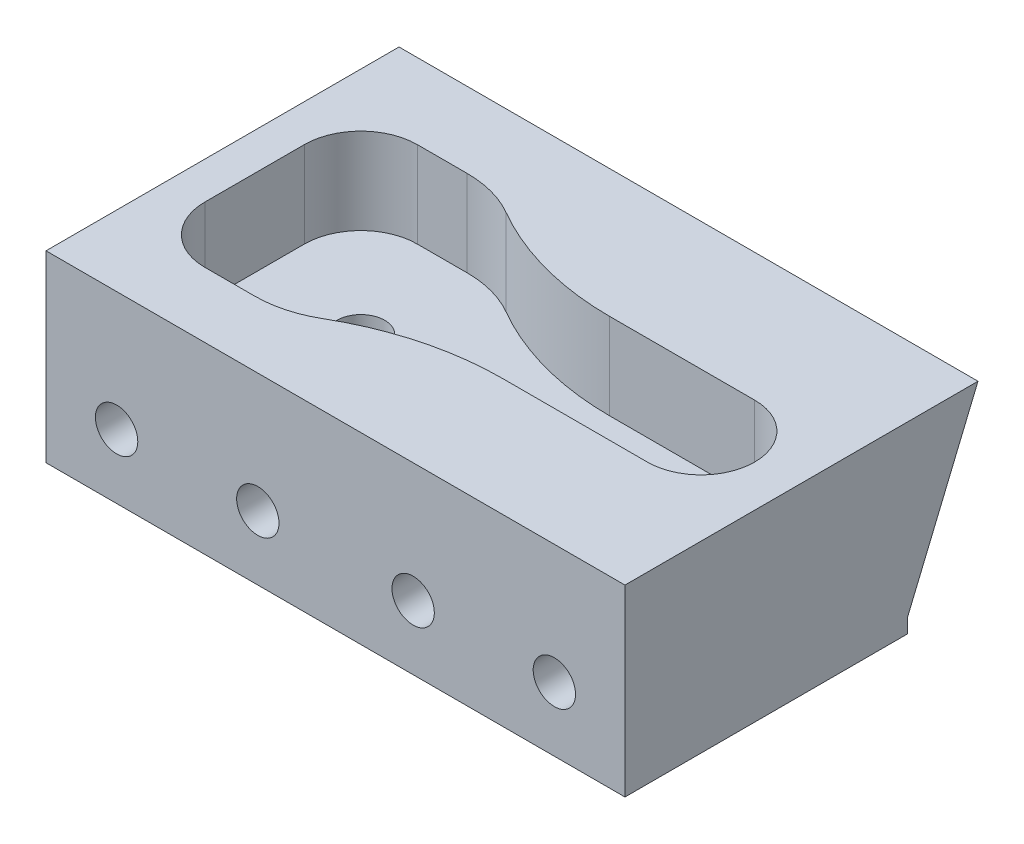
ISO-10303-21;
HEADER;
FILE_DESCRIPTION(('STEP AP214'),'2;1');
FILE_NAME('part.step','',(''),(''),'','','');
FILE_SCHEMA(('AUTOMOTIVE_DESIGN { 1 0 10303 214 1 1 1 1 }'));
ENDSEC;
DATA;
#1=APPLICATION_CONTEXT('core data for automotive mechanical design processes');
#2=APPLICATION_PROTOCOL_DEFINITION('international standard','automotive_design',2000,#1);
#3=PRODUCT_CONTEXT('',#1,'mechanical');
#4=PRODUCT('Part','Part','',(#3));
#5=PRODUCT_RELATED_PRODUCT_CATEGORY('part','',(#4));
#6=PRODUCT_DEFINITION_FORMATION('','',#4);
#7=PRODUCT_DEFINITION_CONTEXT('part definition',#1,'design');
#8=PRODUCT_DEFINITION('design','',#6,#7);
#9=PRODUCT_DEFINITION_SHAPE('','',#8);
#10=(LENGTH_UNIT() NAMED_UNIT(*) SI_UNIT(.MILLI.,.METRE.));
#11=(NAMED_UNIT(*) PLANE_ANGLE_UNIT() SI_UNIT($,.RADIAN.));
#12=(NAMED_UNIT(*) SI_UNIT($,.STERADIAN.) SOLID_ANGLE_UNIT());
#13=UNCERTAINTY_MEASURE_WITH_UNIT(LENGTH_MEASURE(1.E-05),#10,'distance_accuracy_value','');
#14=(GEOMETRIC_REPRESENTATION_CONTEXT(3) GLOBAL_UNCERTAINTY_ASSIGNED_CONTEXT((#13)) GLOBAL_UNIT_ASSIGNED_CONTEXT((#10,
#11,#12)) REPRESENTATION_CONTEXT('',''));
#15=CARTESIAN_POINT('',(0.,0.,0.));
#16=DIRECTION('',(0.,0.,1.));
#17=DIRECTION('',(1.,0.,0.));
#18=AXIS2_PLACEMENT_3D('',#15,#16,#17);
#19=CARTESIAN_POINT('',(35.95,3.4,-12.135));
#20=DIRECTION('',(0.,1.,0.));
#21=DIRECTION('',(0.,0.,1.));
#22=AXIS2_PLACEMENT_3D('',#19,#20,#21);
#23=PLANE('',#22);
#24=DIRECTION('',(0.,0.,-1.));
#25=VECTOR('',#24,1.);
#26=CARTESIAN_POINT('',(35.95,3.4,0.));
#27=LINE('',#26,#25);
#28=CARTESIAN_POINT('',(35.95,3.4,-9.66315858113835));
#29=VERTEX_POINT('',#28);
#30=CARTESIAN_POINT('',(35.95,3.4,-12.135));
#31=VERTEX_POINT('',#30);
#32=EDGE_CURVE('E225',#29,#31,#27,.T.);
#33=ORIENTED_EDGE('',*,*,#32,.F.);
#34=CARTESIAN_POINT('',(34.25,3.4,-12.135));
#35=DIRECTION('',(0.,-1.,0.));
#36=DIRECTION('',(0.,0.,-1.));
#37=AXIS2_PLACEMENT_3D('',#34,#35,#36);
#38=CIRCLE('',#37,3.);
#39=CARTESIAN_POINT('',(32.55,3.4,-9.66315858113835));
#40=VERTEX_POINT('',#39);
#41=EDGE_CURVE('E230',#29,#40,#38,.T.);
#42=ORIENTED_EDGE('',*,*,#41,.T.);
#43=DIRECTION('',(0.,0.,-1.));
#44=VECTOR('',#43,1.);
#45=CARTESIAN_POINT('',(32.55,3.4,0.));
#46=LINE('',#45,#44);
#47=CARTESIAN_POINT('',(32.55,3.4,-12.135));
#48=VERTEX_POINT('',#47);
#49=EDGE_CURVE('E234',#40,#48,#46,.T.);
#50=ORIENTED_EDGE('',*,*,#49,.T.);
#51=CARTESIAN_POINT('',(34.25,3.4,-12.135));
#52=DIRECTION('',(0.,-1.,0.));
#53=DIRECTION('',(0.,0.,-1.));
#54=AXIS2_PLACEMENT_3D('',#51,#52,#53);
#55=CIRCLE('',#54,1.70000000000001);
#56=EDGE_CURVE('E300',#31,#48,#55,.T.);
#57=ORIENTED_EDGE('',*,*,#56,.F.);
#58=EDGE_LOOP('',(#33,#42,#50,#57));
#59=FACE_BOUND('',#58,.T.);
#60=ADVANCED_FACE('F37',(#59),#23,.F.);
#61=CARTESIAN_POINT('',(35.95,3.4,-14.6068414188616));
#62=VERTEX_POINT('',#61);
#63=EDGE_CURVE('E943',#31,#62,#27,.T.);
#64=ORIENTED_EDGE('',*,*,#63,.F.);
#65=EDGE_CURVE('E301',#48,#31,#55,.T.);
#66=ORIENTED_EDGE('',*,*,#65,.F.);
#67=CARTESIAN_POINT('',(32.55,3.4,-14.6068414188616));
#68=VERTEX_POINT('',#67);
#69=EDGE_CURVE('E231',#48,#68,#46,.T.);
#70=ORIENTED_EDGE('',*,*,#69,.T.);
#71=EDGE_CURVE('E297',#68,#62,#38,.T.);
#72=ORIENTED_EDGE('',*,*,#71,.T.);
#73=EDGE_LOOP('',(#64,#66,#70,#72));
#74=FACE_BOUND('',#73,.T.);
#75=ADVANCED_FACE('F499',(#74),#23,.F.);
#76=CARTESIAN_POINT('',(34.25,0.,-12.135));
#77=DIRECTION('',(0.,-1.,0.));
#78=DIRECTION('',(0.,0.,-1.));
#79=AXIS2_PLACEMENT_3D('',#76,#77,#78);
#80=CYLINDRICAL_SURFACE('',#79,3.);
#81=CARTESIAN_POINT('',(34.25,0.,-12.135));
#82=DIRECTION('',(0.,-1.,0.));
#83=DIRECTION('',(0.,0.,-1.));
#84=AXIS2_PLACEMENT_3D('',#81,#82,#83);
#85=CIRCLE('',#84,3.);
#86=CARTESIAN_POINT('',(34.25,0.,-15.135));
#87=VERTEX_POINT('',#86);
#88=EDGE_CURVE('E294',#87,#87,#85,.T.);
#89=ORIENTED_EDGE('',*,*,#88,.T.);
#90=EDGE_LOOP('',(#89));
#91=FACE_BOUND('',#90,.T.);
#92=DIRECTION('',(0.,1.,0.));
#93=VECTOR('',#92,1.);
#94=CARTESIAN_POINT('',(35.95,3.2,-9.66315858113835));
#95=LINE('',#94,#93);
#96=CARTESIAN_POINT('',(35.95,3.2,-9.66315858113835));
#97=VERTEX_POINT('',#96);
#98=EDGE_CURVE('E217',#97,#29,#95,.T.);
#99=ORIENTED_EDGE('',*,*,#98,.F.);
#100=CARTESIAN_POINT('',(34.25,3.2,-12.135));
#101=DIRECTION('',(0.,-1.,0.));
#102=DIRECTION('',(0.,0.,-1.));
#103=AXIS2_PLACEMENT_3D('',#100,#101,#102);
#104=CIRCLE('',#103,3.);
#105=CARTESIAN_POINT('',(35.95,3.2,-14.6068414188617));
#106=VERTEX_POINT('',#105);
#107=EDGE_CURVE('E221',#106,#97,#104,.T.);
#108=ORIENTED_EDGE('',*,*,#107,.F.);
#109=DIRECTION('',(0.,1.,0.));
#110=VECTOR('',#109,1.);
#111=CARTESIAN_POINT('',(35.95,3.2,-14.6068414188616));
#112=LINE('',#111,#110);
#113=EDGE_CURVE('E52',#106,#62,#112,.T.);
#114=ORIENTED_EDGE('',*,*,#113,.T.);
#115=ORIENTED_EDGE('',*,*,#71,.F.);
#116=DIRECTION('',(0.,1.,0.));
#117=VECTOR('',#116,1.);
#118=CARTESIAN_POINT('',(32.55,3.2,-14.6068414188616));
#119=LINE('',#118,#117);
#120=CARTESIAN_POINT('',(32.55,3.2,-14.6068414188616));
#121=VERTEX_POINT('',#120);
#122=EDGE_CURVE('E241',#121,#68,#119,.T.);
#123=ORIENTED_EDGE('',*,*,#122,.F.);
#124=CARTESIAN_POINT('',(34.25,3.2,-12.135));
#125=DIRECTION('',(0.,-1.,0.));
#126=DIRECTION('',(0.,0.,-1.));
#127=AXIS2_PLACEMENT_3D('',#124,#125,#126);
#128=CIRCLE('',#127,3.);
#129=CARTESIAN_POINT('',(32.55,3.2,-9.66315858113835));
#130=VERTEX_POINT('',#129);
#131=EDGE_CURVE('E240',#130,#121,#128,.T.);
#132=ORIENTED_EDGE('',*,*,#131,.F.);
#133=DIRECTION('',(0.,1.,0.));
#134=VECTOR('',#133,1.);
#135=CARTESIAN_POINT('',(32.55,3.2,-9.66315858113835));
#136=LINE('',#135,#134);
#137=EDGE_CURVE('E245',#130,#40,#136,.T.);
#138=ORIENTED_EDGE('',*,*,#137,.T.);
#139=ORIENTED_EDGE('',*,*,#41,.F.);
#140=EDGE_LOOP('',(#99,#108,#114,#115,#123,#132,#138,#139));
#141=FACE_BOUND('',#140,.T.);
#142=ADVANCED_FACE('F228',(#91,#141),#80,.F.);
#143=CARTESIAN_POINT('',(11.86,3.4,-12.135));
#144=DIRECTION('',(0.,1.,0.));
#145=DIRECTION('',(0.,0.,1.));
#146=AXIS2_PLACEMENT_3D('',#143,#144,#145);
#147=PLANE('',#146);
#148=DIRECTION('',(0.,0.,-1.));
#149=VECTOR('',#148,1.);
#150=CARTESIAN_POINT('',(11.86,3.4,0.));
#151=LINE('',#150,#149);
#152=CARTESIAN_POINT('',(11.86,3.4,-9.66315858113835));
#153=VERTEX_POINT('',#152);
#154=CARTESIAN_POINT('',(11.86,3.4,-12.135));
#155=VERTEX_POINT('',#154);
#156=EDGE_CURVE('E252',#153,#155,#151,.T.);
#157=ORIENTED_EDGE('',*,*,#156,.F.);
#158=CARTESIAN_POINT('',(10.16,3.4,-12.135));
#159=DIRECTION('',(0.,-1.,0.));
#160=DIRECTION('',(0.,0.,-1.));
#161=AXIS2_PLACEMENT_3D('',#158,#159,#160);
#162=CIRCLE('',#161,3.);
#163=CARTESIAN_POINT('',(8.45999999999999,3.4,-9.66315858113835));
#164=VERTEX_POINT('',#163);
#165=EDGE_CURVE('E308',#153,#164,#162,.T.);
#166=ORIENTED_EDGE('',*,*,#165,.T.);
#167=DIRECTION('',(0.,0.,-1.));
#168=VECTOR('',#167,1.);
#169=CARTESIAN_POINT('',(8.45999999999999,3.4,0.));
#170=LINE('',#169,#168);
#171=CARTESIAN_POINT('',(8.45999999999999,3.4,-12.135));
#172=VERTEX_POINT('',#171);
#173=EDGE_CURVE('E266',#164,#172,#170,.T.);
#174=ORIENTED_EDGE('',*,*,#173,.T.);
#175=CARTESIAN_POINT('',(10.16,3.4,-12.135));
#176=DIRECTION('',(0.,-1.,0.));
#177=DIRECTION('',(0.,0.,-1.));
#178=AXIS2_PLACEMENT_3D('',#175,#176,#177);
#179=CIRCLE('',#178,1.70000000000001);
#180=EDGE_CURVE('E312',#155,#172,#179,.T.);
#181=ORIENTED_EDGE('',*,*,#180,.F.);
#182=EDGE_LOOP('',(#157,#166,#174,#181));
#183=FACE_BOUND('',#182,.T.);
#184=ADVANCED_FACE('F519',(#183),#147,.F.);
#185=CARTESIAN_POINT('',(11.86,3.4,-14.6068414188616));
#186=VERTEX_POINT('',#185);
#187=EDGE_CURVE('E247',#155,#186,#151,.T.);
#188=ORIENTED_EDGE('',*,*,#187,.F.);
#189=EDGE_CURVE('E313',#172,#155,#179,.T.);
#190=ORIENTED_EDGE('',*,*,#189,.F.);
#191=CARTESIAN_POINT('',(8.45999999999999,3.4,-14.6068414188616));
#192=VERTEX_POINT('',#191);
#193=EDGE_CURVE('E261',#172,#192,#170,.T.);
#194=ORIENTED_EDGE('',*,*,#193,.T.);
#195=EDGE_CURVE('E309',#192,#186,#162,.T.);
#196=ORIENTED_EDGE('',*,*,#195,.T.);
#197=EDGE_LOOP('',(#188,#190,#194,#196));
#198=FACE_BOUND('',#197,.T.);
#199=ADVANCED_FACE('F517',(#198),#147,.F.);
#200=CARTESIAN_POINT('',(10.16,0.,-12.135));
#201=DIRECTION('',(0.,-1.,0.));
#202=DIRECTION('',(0.,0.,-1.));
#203=AXIS2_PLACEMENT_3D('',#200,#201,#202);
#204=CYLINDRICAL_SURFACE('',#203,3.);
#205=CARTESIAN_POINT('',(10.16,0.,-12.135));
#206=DIRECTION('',(0.,-1.,0.));
#207=DIRECTION('',(0.,0.,-1.));
#208=AXIS2_PLACEMENT_3D('',#205,#206,#207);
#209=CIRCLE('',#208,3.);
#210=CARTESIAN_POINT('',(10.16,0.,-15.135));
#211=VERTEX_POINT('',#210);
#212=EDGE_CURVE('E305',#211,#211,#209,.T.);
#213=ORIENTED_EDGE('',*,*,#212,.T.);
#214=EDGE_LOOP('',(#213));
#215=FACE_BOUND('',#214,.T.);
#216=DIRECTION('',(0.,1.,0.));
#217=VECTOR('',#216,1.);
#218=CARTESIAN_POINT('',(11.86,3.2,-9.66315858113835));
#219=LINE('',#218,#217);
#220=CARTESIAN_POINT('',(11.86,3.2,-9.66315858113835));
#221=VERTEX_POINT('',#220);
#222=EDGE_CURVE('E259',#221,#153,#219,.T.);
#223=ORIENTED_EDGE('',*,*,#222,.F.);
#224=CARTESIAN_POINT('',(10.16,3.2,-12.135));
#225=DIRECTION('',(0.,-1.,0.));
#226=DIRECTION('',(0.,0.,-1.));
#227=AXIS2_PLACEMENT_3D('',#224,#225,#226);
#228=CIRCLE('',#227,3.);
#229=CARTESIAN_POINT('',(11.86,3.2,-14.6068414188616));
#230=VERTEX_POINT('',#229);
#231=EDGE_CURVE('E248',#230,#221,#228,.T.);
#232=ORIENTED_EDGE('',*,*,#231,.F.);
#233=DIRECTION('',(0.,1.,0.));
#234=VECTOR('',#233,1.);
#235=CARTESIAN_POINT('',(11.86,3.2,-14.6068414188616));
#236=LINE('',#235,#234);
#237=EDGE_CURVE('E255',#230,#186,#236,.T.);
#238=ORIENTED_EDGE('',*,*,#237,.T.);
#239=ORIENTED_EDGE('',*,*,#195,.F.);
#240=DIRECTION('',(0.,1.,0.));
#241=VECTOR('',#240,1.);
#242=CARTESIAN_POINT('',(8.45999999999999,3.2,-14.6068414188616));
#243=LINE('',#242,#241);
#244=CARTESIAN_POINT('',(8.45999999999999,3.2,-14.6068414188616));
#245=VERTEX_POINT('',#244);
#246=EDGE_CURVE('E268',#245,#192,#243,.T.);
#247=ORIENTED_EDGE('',*,*,#246,.F.);
#248=CARTESIAN_POINT('',(10.16,3.2,-12.135));
#249=DIRECTION('',(0.,-1.,0.));
#250=DIRECTION('',(0.,0.,-1.));
#251=AXIS2_PLACEMENT_3D('',#248,#249,#250);
#252=CIRCLE('',#251,3.);
#253=CARTESIAN_POINT('',(8.45999999999999,3.2,-9.66315858113835));
#254=VERTEX_POINT('',#253);
#255=EDGE_CURVE('E265',#254,#245,#252,.T.);
#256=ORIENTED_EDGE('',*,*,#255,.F.);
#257=DIRECTION('',(0.,1.,0.));
#258=VECTOR('',#257,1.);
#259=CARTESIAN_POINT('',(8.45999999999999,3.2,-9.66315858113835));
#260=LINE('',#259,#258);
#261=EDGE_CURVE('E272',#254,#164,#260,.T.);
#262=ORIENTED_EDGE('',*,*,#261,.T.);
#263=ORIENTED_EDGE('',*,*,#165,.F.);
#264=EDGE_LOOP('',(#223,#232,#238,#239,#247,#256,#262,#263));
#265=FACE_BOUND('',#264,.T.);
#266=ADVANCED_FACE('F514',(#215,#265),#204,.F.);
#267=CARTESIAN_POINT('',(0.,13.,0.));
#268=DIRECTION('',(1.,0.,0.));
#269=DIRECTION('',(0.,0.,-1.));
#270=AXIS2_PLACEMENT_3D('',#267,#268,#269);
#271=PLANE('',#270);
#272=DIRECTION('',(0.,0.,1.));
#273=VECTOR('',#272,1.);
#274=CARTESIAN_POINT('',(0.,13.,0.));
#275=LINE('',#274,#273);
#276=CARTESIAN_POINT('',(0.,13.,-25.));
#277=VERTEX_POINT('',#276);
#278=CARTESIAN_POINT('',(0.,13.,0.));
#279=VERTEX_POINT('',#278);
#280=EDGE_CURVE('E405',#277,#279,#275,.T.);
#281=ORIENTED_EDGE('',*,*,#280,.F.);
#282=DIRECTION('',(0.,-0.923076923076923,0.384615384615385));
#283=VECTOR('',#282,1.);
#284=CARTESIAN_POINT('',(0.,4.12426035502958,-21.301775147929));
#285=LINE('',#284,#283);
#286=CARTESIAN_POINT('',(0.,1.,-20.));
#287=VERTEX_POINT('',#286);
#288=EDGE_CURVE('E287',#277,#287,#285,.T.);
#289=ORIENTED_EDGE('',*,*,#288,.T.);
#290=DIRECTION('',(0.,-1.,0.));
#291=VECTOR('',#290,1.);
#292=CARTESIAN_POINT('',(0.,13.,-20.));
#293=LINE('',#292,#291);
#294=CARTESIAN_POINT('',(0.,0.,-20.));
#295=VERTEX_POINT('',#294);
#296=EDGE_CURVE('E291',#287,#295,#293,.T.);
#297=ORIENTED_EDGE('',*,*,#296,.T.);
#298=DIRECTION('',(0.,0.,1.));
#299=VECTOR('',#298,1.);
#300=CARTESIAN_POINT('',(0.,0.,0.));
#301=LINE('',#300,#299);
#302=CARTESIAN_POINT('',(0.,0.,0.));
#303=VERTEX_POINT('',#302);
#304=EDGE_CURVE('E404',#295,#303,#301,.T.);
#305=ORIENTED_EDGE('',*,*,#304,.T.);
#306=DIRECTION('',(0.,-1.,0.));
#307=VECTOR('',#306,1.);
#308=CARTESIAN_POINT('',(0.,13.,0.));
#309=LINE('',#308,#307);
#310=EDGE_CURVE('E424',#279,#303,#309,.T.);
#311=ORIENTED_EDGE('',*,*,#310,.F.);
#312=EDGE_LOOP('',(#281,#289,#297,#305,#311));
#313=FACE_BOUND('',#312,.T.);
#314=ADVANCED_FACE('F470',(#313),#271,.F.);
#315=CARTESIAN_POINT('',(0.,13.,0.));
#316=DIRECTION('',(0.,0.,-1.));
#317=DIRECTION('',(-1.,0.,0.));
#318=AXIS2_PLACEMENT_3D('',#315,#316,#317);
#319=PLANE('',#318);
#320=CARTESIAN_POINT('',(36.,4.545,0.));
#321=DIRECTION('',(0.,0.,1.));
#322=DIRECTION('',(1.,0.,0.));
#323=AXIS2_PLACEMENT_3D('',#320,#321,#322);
#324=CIRCLE('',#323,1.5);
#325=CARTESIAN_POINT('',(37.5,4.545,0.));
#326=VERTEX_POINT('',#325);
#327=EDGE_CURVE('E375',#326,#326,#324,.T.);
#328=ORIENTED_EDGE('',*,*,#327,.F.);
#329=EDGE_LOOP('',(#328));
#330=FACE_BOUND('',#329,.T.);
#331=CARTESIAN_POINT('',(26.,4.545,0.));
#332=DIRECTION('',(0.,0.,1.));
#333=DIRECTION('',(1.,0.,0.));
#334=AXIS2_PLACEMENT_3D('',#331,#332,#333);
#335=CIRCLE('',#334,1.5);
#336=CARTESIAN_POINT('',(27.5,4.545,0.));
#337=VERTEX_POINT('',#336);
#338=EDGE_CURVE('E393',#337,#337,#335,.T.);
#339=ORIENTED_EDGE('',*,*,#338,.F.);
#340=EDGE_LOOP('',(#339));
#341=FACE_BOUND('',#340,.T.);
#342=CARTESIAN_POINT('',(15.,4.545,0.));
#343=DIRECTION('',(0.,0.,1.));
#344=DIRECTION('',(1.,0.,0.));
#345=AXIS2_PLACEMENT_3D('',#342,#343,#344);
#346=CIRCLE('',#345,1.5);
#347=CARTESIAN_POINT('',(16.5,4.545,0.));
#348=VERTEX_POINT('',#347);
#349=EDGE_CURVE('E398',#348,#348,#346,.T.);
#350=ORIENTED_EDGE('',*,*,#349,.F.);
#351=EDGE_LOOP('',(#350));
#352=FACE_BOUND('',#351,.T.);
#353=CARTESIAN_POINT('',(5.,4.545,0.));
#354=DIRECTION('',(0.,0.,1.));
#355=DIRECTION('',(1.,0.,0.));
#356=AXIS2_PLACEMENT_3D('',#353,#354,#355);
#357=CIRCLE('',#356,1.5);
#358=CARTESIAN_POINT('',(6.5,4.545,0.));
#359=VERTEX_POINT('',#358);
#360=EDGE_CURVE('E401',#359,#359,#357,.T.);
#361=ORIENTED_EDGE('',*,*,#360,.F.);
#362=EDGE_LOOP('',(#361));
#363=FACE_BOUND('',#362,.T.);
#364=DIRECTION('',(1.,0.,0.));
#365=VECTOR('',#364,1.);
#366=CARTESIAN_POINT('',(0.,0.,0.));
#367=LINE('',#366,#365);
#368=CARTESIAN_POINT('',(41.,0.,0.));
#369=VERTEX_POINT('',#368);
#370=EDGE_CURVE('E418',#303,#369,#367,.T.);
#371=ORIENTED_EDGE('',*,*,#370,.T.);
#372=DIRECTION('',(0.,-1.,0.));
#373=VECTOR('',#372,1.);
#374=CARTESIAN_POINT('',(41.,13.,0.));
#375=LINE('',#374,#373);
#376=CARTESIAN_POINT('',(41.,13.,0.));
#377=VERTEX_POINT('',#376);
#378=EDGE_CURVE('E416',#377,#369,#375,.T.);
#379=ORIENTED_EDGE('',*,*,#378,.F.);
#380=DIRECTION('',(1.,0.,0.));
#381=VECTOR('',#380,1.);
#382=CARTESIAN_POINT('',(0.,13.,0.));
#383=LINE('',#382,#381);
#384=EDGE_CURVE('E408',#279,#377,#383,.T.);
#385=ORIENTED_EDGE('',*,*,#384,.F.);
#386=ORIENTED_EDGE('',*,*,#310,.T.);
#387=EDGE_LOOP('',(#371,#379,#385,#386));
#388=FACE_BOUND('',#387,.T.);
#389=ADVANCED_FACE('F484',(#330,#341,#352,#363,#388),#319,.F.);
#390=CARTESIAN_POINT('',(41.,13.,0.));
#391=DIRECTION('',(-1.,0.,0.));
#392=DIRECTION('',(0.,0.,1.));
#393=AXIS2_PLACEMENT_3D('',#390,#391,#392);
#394=PLANE('',#393);
#395=DIRECTION('',(0.,1.,0.));
#396=VECTOR('',#395,1.);
#397=CARTESIAN_POINT('',(41.,13.,-20.));
#398=LINE('',#397,#396);
#399=CARTESIAN_POINT('',(41.,0.,-20.));
#400=VERTEX_POINT('',#399);
#401=CARTESIAN_POINT('',(41.,1.,-20.));
#402=VERTEX_POINT('',#401);
#403=EDGE_CURVE('E289',#400,#402,#398,.T.);
#404=ORIENTED_EDGE('',*,*,#403,.T.);
#405=DIRECTION('',(0.,0.923076923076923,-0.384615384615385));
#406=VECTOR('',#405,1.);
#407=CARTESIAN_POINT('',(41.,4.12426035502958,-21.301775147929));
#408=LINE('',#407,#406);
#409=CARTESIAN_POINT('',(41.,13.,-25.));
#410=VERTEX_POINT('',#409);
#411=EDGE_CURVE('E285',#402,#410,#408,.T.);
#412=ORIENTED_EDGE('',*,*,#411,.T.);
#413=DIRECTION('',(0.,0.,-1.));
#414=VECTOR('',#413,1.);
#415=CARTESIAN_POINT('',(41.,13.,0.));
#416=LINE('',#415,#414);
#417=EDGE_CURVE('E411',#377,#410,#416,.T.);
#418=ORIENTED_EDGE('',*,*,#417,.F.);
#419=ORIENTED_EDGE('',*,*,#378,.T.);
#420=DIRECTION('',(0.,0.,-1.));
#421=VECTOR('',#420,1.);
#422=CARTESIAN_POINT('',(41.,0.,0.));
#423=LINE('',#422,#421);
#424=EDGE_CURVE('E409',#369,#400,#423,.T.);
#425=ORIENTED_EDGE('',*,*,#424,.T.);
#426=EDGE_LOOP('',(#404,#412,#418,#419,#425));
#427=FACE_BOUND('',#426,.T.);
#428=ADVANCED_FACE('F480',(#427),#394,.F.);
#429=CARTESIAN_POINT('',(0.,13.,0.));
#430=DIRECTION('',(0.,-1.,0.));
#431=DIRECTION('',(0.,0.,-1.));
#432=AXIS2_PLACEMENT_3D('',#429,#430,#431);
#433=PLANE('',#432);
#434=DIRECTION('',(-1.,0.,0.));
#435=VECTOR('',#434,1.);
#436=CARTESIAN_POINT('',(0.,13.,-8.335));
#437=LINE('',#436,#435);
#438=CARTESIAN_POINT('',(34.25,13.,-8.335));
#439=VERTEX_POINT('',#438);
#440=CARTESIAN_POINT('',(23.9869890070109,13.,-8.335));
#441=VERTEX_POINT('',#440);
#442=EDGE_CURVE('E365',#439,#441,#437,.T.);
#443=ORIENTED_EDGE('',*,*,#442,.T.);
#444=CARTESIAN_POINT('',(23.9869890070109,13.,11.665));
#445=DIRECTION('',(0.,-1.,0.));
#446=DIRECTION('',(0.,0.,-1.));
#447=AXIS2_PLACEMENT_3D('',#444,#445,#446);
#448=CIRCLE('',#447,20.);
#449=CARTESIAN_POINT('',(13.9401305096369,13.,-5.62836966394187));
#450=VERTEX_POINT('',#449);
#451=EDGE_CURVE('E436',#441,#450,#448,.F.);
#452=ORIENTED_EDGE('',*,*,#451,.T.);
#453=CARTESIAN_POINT('',(10.16,13.,-12.135));
#454=DIRECTION('',(0.,1.,0.));
#455=DIRECTION('',(0.,0.,1.));
#456=AXIS2_PLACEMENT_3D('',#453,#454,#455);
#457=CIRCLE('',#456,7.525);
#458=CARTESIAN_POINT('',(10.16,13.,-4.61));
#459=VERTEX_POINT('',#458);
#460=EDGE_CURVE('E362',#459,#450,#457,.T.);
#461=ORIENTED_EDGE('',*,*,#460,.F.);
#462=DIRECTION('',(-1.,0.,0.));
#463=VECTOR('',#462,1.);
#464=CARTESIAN_POINT('',(0.,13.,-4.60999999999999));
#465=LINE('',#464,#463);
#466=CARTESIAN_POINT('',(6.635,13.,-4.61));
#467=VERTEX_POINT('',#466);
#468=EDGE_CURVE('E359',#459,#467,#465,.T.);
#469=ORIENTED_EDGE('',*,*,#468,.T.);
#470=CARTESIAN_POINT('',(6.635,13.,-8.61));
#471=DIRECTION('',(0.,1.,0.));
#472=DIRECTION('',(0.,0.,1.));
#473=AXIS2_PLACEMENT_3D('',#470,#471,#472);
#474=CIRCLE('',#473,4.);
#475=CARTESIAN_POINT('',(2.635,13.,-8.61));
#476=VERTEX_POINT('',#475);
#477=EDGE_CURVE('E356',#467,#476,#474,.F.);
#478=ORIENTED_EDGE('',*,*,#477,.T.);
#479=DIRECTION('',(0.,0.,-1.));
#480=VECTOR('',#479,1.);
#481=CARTESIAN_POINT('',(2.635,13.,0.));
#482=LINE('',#481,#480);
#483=CARTESIAN_POINT('',(2.635,13.,-15.66));
#484=VERTEX_POINT('',#483);
#485=EDGE_CURVE('E353',#476,#484,#482,.T.);
#486=ORIENTED_EDGE('',*,*,#485,.T.);
#487=CARTESIAN_POINT('',(6.635,13.,-15.66));
#488=DIRECTION('',(0.,1.,0.));
#489=DIRECTION('',(0.,0.,1.));
#490=AXIS2_PLACEMENT_3D('',#487,#488,#489);
#491=CIRCLE('',#490,4.);
#492=CARTESIAN_POINT('',(6.635,13.,-19.66));
#493=VERTEX_POINT('',#492);
#494=EDGE_CURVE('E350',#493,#484,#491,.T.);
#495=ORIENTED_EDGE('',*,*,#494,.F.);
#496=DIRECTION('',(-1.,0.,0.));
#497=VECTOR('',#496,1.);
#498=CARTESIAN_POINT('',(0.,13.,-19.66));
#499=LINE('',#498,#497);
#500=CARTESIAN_POINT('',(10.16,13.,-19.66));
#501=VERTEX_POINT('',#500);
#502=EDGE_CURVE('E347',#501,#493,#499,.T.);
#503=ORIENTED_EDGE('',*,*,#502,.F.);
#504=CARTESIAN_POINT('',(10.16,13.,-12.135));
#505=DIRECTION('',(0.,1.,0.));
#506=DIRECTION('',(0.,0.,1.));
#507=AXIS2_PLACEMENT_3D('',#504,#505,#506);
#508=CIRCLE('',#507,7.525);
#509=CARTESIAN_POINT('',(13.9401305096369,13.,-18.6416303360581));
#510=VERTEX_POINT('',#509);
#511=EDGE_CURVE('E345',#510,#501,#508,.T.);
#512=ORIENTED_EDGE('',*,*,#511,.F.);
#513=CARTESIAN_POINT('',(23.9869890070109,13.,-35.935));
#514=DIRECTION('',(0.,-1.,0.));
#515=DIRECTION('',(0.,0.,-1.));
#516=AXIS2_PLACEMENT_3D('',#513,#514,#515);
#517=CIRCLE('',#516,20.);
#518=CARTESIAN_POINT('',(23.9869890070109,13.,-15.935));
#519=VERTEX_POINT('',#518);
#520=EDGE_CURVE('E434',#510,#519,#517,.F.);
#521=ORIENTED_EDGE('',*,*,#520,.T.);
#522=DIRECTION('',(-1.,0.,0.));
#523=VECTOR('',#522,1.);
#524=CARTESIAN_POINT('',(0.,13.,-15.935));
#525=LINE('',#524,#523);
#526=CARTESIAN_POINT('',(34.25,13.,-15.935));
#527=VERTEX_POINT('',#526);
#528=EDGE_CURVE('E320',#527,#519,#525,.T.);
#529=ORIENTED_EDGE('',*,*,#528,.F.);
#530=CARTESIAN_POINT('',(34.25,13.,-12.135));
#531=DIRECTION('',(0.,1.,0.));
#532=DIRECTION('',(0.,0.,1.));
#533=AXIS2_PLACEMENT_3D('',#530,#531,#532);
#534=CIRCLE('',#533,3.8);
#535=EDGE_CURVE('E368',#439,#527,#534,.T.);
#536=ORIENTED_EDGE('',*,*,#535,.F.);
#537=EDGE_LOOP('',(#443,#452,#461,#469,#478,#486,#495,#503,#512,#521,#529,#536));
#538=FACE_BOUND('',#537,.T.);
#539=ORIENTED_EDGE('',*,*,#280,.T.);
#540=ORIENTED_EDGE('',*,*,#384,.T.);
#541=ORIENTED_EDGE('',*,*,#417,.T.);
#542=DIRECTION('',(-1.,0.,0.));
#543=VECTOR('',#542,1.);
#544=CARTESIAN_POINT('',(0.,13.,-25.));
#545=LINE('',#544,#543);
#546=EDGE_CURVE('E414',#410,#277,#545,.T.);
#547=ORIENTED_EDGE('',*,*,#546,.T.);
#548=EDGE_LOOP('',(#539,#540,#541,#547));
#549=FACE_BOUND('',#548,.T.);
#550=ADVANCED_FACE('F486',(#538,#549),#433,.F.);
#551=CARTESIAN_POINT('',(0.,0.,0.));
#552=DIRECTION('',(0.,-1.,0.));
#553=DIRECTION('',(0.,0.,-1.));
#554=AXIS2_PLACEMENT_3D('',#551,#552,#553);
#555=PLANE('',#554);
#556=DIRECTION('',(-1.,0.,0.));
#557=VECTOR('',#556,1.);
#558=CARTESIAN_POINT('',(0.,0.,-20.));
#559=LINE('',#558,#557);
#560=EDGE_CURVE('E11',#400,#295,#559,.T.);
#561=ORIENTED_EDGE('',*,*,#560,.F.);
#562=ORIENTED_EDGE('',*,*,#424,.F.);
#563=ORIENTED_EDGE('',*,*,#370,.F.);
#564=ORIENTED_EDGE('',*,*,#304,.F.);
#565=EDGE_LOOP('',(#561,#562,#563,#564));
#566=FACE_BOUND('',#565,.T.);
#567=ORIENTED_EDGE('',*,*,#88,.F.);
#568=EDGE_LOOP('',(#567));
#569=FACE_BOUND('',#568,.T.);
#570=ORIENTED_EDGE('',*,*,#212,.F.);
#571=EDGE_LOOP('',(#570));
#572=FACE_BOUND('',#571,.T.);
#573=ADVANCED_FACE('F476',(#566,#569,#572),#555,.T.);
#574=CARTESIAN_POINT('',(5.,4.545,-25.));
#575=DIRECTION('',(0.,0.,1.));
#576=DIRECTION('',(1.,0.,0.));
#577=AXIS2_PLACEMENT_3D('',#574,#575,#576);
#578=CYLINDRICAL_SURFACE('',#577,1.5);
#579=CARTESIAN_POINT('',(5.,4.545,-21.4770833333333));
#580=DIRECTION('',(0.,0.384615384615385,0.923076923076923));
#581=DIRECTION('',(0.,-0.923076923076923,0.384615384615385));
#582=AXIS2_PLACEMENT_3D('',#579,#580,#581);
#583=ELLIPSE('',#582,1.625,1.5);
#584=CARTESIAN_POINT('',(5.,3.045,-20.8520833333333));
#585=VERTEX_POINT('',#584);
#586=EDGE_CURVE('E282',#585,#585,#583,.F.);
#587=ORIENTED_EDGE('',*,*,#586,.T.);
#588=EDGE_LOOP('',(#587));
#589=FACE_BOUND('',#588,.T.);
#590=ORIENTED_EDGE('',*,*,#360,.T.);
#591=EDGE_LOOP('',(#590));
#592=FACE_BOUND('',#591,.T.);
#593=ADVANCED_FACE('F494',(#589,#592),#578,.F.);
#594=CARTESIAN_POINT('',(15.,4.545,-25.));
#595=DIRECTION('',(0.,0.,1.));
#596=DIRECTION('',(1.,0.,0.));
#597=AXIS2_PLACEMENT_3D('',#594,#595,#596);
#598=CYLINDRICAL_SURFACE('',#597,1.5);
#599=CARTESIAN_POINT('',(15.,4.545,-21.4770833333333));
#600=DIRECTION('',(0.,0.384615384615385,0.923076923076923));
#601=DIRECTION('',(0.,-0.923076923076923,0.384615384615385));
#602=AXIS2_PLACEMENT_3D('',#599,#600,#601);
#603=ELLIPSE('',#602,1.625,1.5);
#604=CARTESIAN_POINT('',(15.,3.045,-20.8520833333333));
#605=VERTEX_POINT('',#604);
#606=EDGE_CURVE('E279',#605,#605,#603,.F.);
#607=ORIENTED_EDGE('',*,*,#606,.T.);
#608=EDGE_LOOP('',(#607));
#609=FACE_BOUND('',#608,.T.);
#610=ORIENTED_EDGE('',*,*,#349,.T.);
#611=EDGE_LOOP('',(#610));
#612=FACE_BOUND('',#611,.T.);
#613=ADVANCED_FACE('F580',(#609,#612),#598,.F.);
#614=CARTESIAN_POINT('',(26.,4.545,-25.));
#615=DIRECTION('',(0.,0.,1.));
#616=DIRECTION('',(1.,0.,0.));
#617=AXIS2_PLACEMENT_3D('',#614,#615,#616);
#618=CYLINDRICAL_SURFACE('',#617,1.5);
#619=CARTESIAN_POINT('',(26.,4.545,-21.4770833333333));
#620=DIRECTION('',(0.,0.384615384615385,0.923076923076923));
#621=DIRECTION('',(0.,-0.923076923076923,0.384615384615385));
#622=AXIS2_PLACEMENT_3D('',#619,#620,#621);
#623=ELLIPSE('',#622,1.625,1.5);
#624=CARTESIAN_POINT('',(26.,3.045,-20.8520833333333));
#625=VERTEX_POINT('',#624);
#626=EDGE_CURVE('E278',#625,#625,#623,.F.);
#627=ORIENTED_EDGE('',*,*,#626,.T.);
#628=EDGE_LOOP('',(#627));
#629=FACE_BOUND('',#628,.T.);
#630=ORIENTED_EDGE('',*,*,#338,.T.);
#631=EDGE_LOOP('',(#630));
#632=FACE_BOUND('',#631,.T.);
#633=ADVANCED_FACE('F450',(#629,#632),#618,.F.);
#634=CARTESIAN_POINT('',(36.,4.545,-8.));
#635=DIRECTION('',(0.,0.,1.));
#636=DIRECTION('',(1.,0.,0.));
#637=AXIS2_PLACEMENT_3D('',#634,#635,#636);
#638=CYLINDRICAL_SURFACE('',#637,1.5);
#639=CARTESIAN_POINT('',(36.,4.545,-8.));
#640=DIRECTION('',(0.,0.,1.));
#641=DIRECTION('',(1.,0.,0.));
#642=AXIS2_PLACEMENT_3D('',#639,#640,#641);
#643=CIRCLE('',#642,1.5);
#644=CARTESIAN_POINT('',(37.5,4.545,-8.));
#645=VERTEX_POINT('',#644);
#646=EDGE_CURVE('E390',#645,#645,#643,.T.);
#647=ORIENTED_EDGE('',*,*,#646,.F.);
#648=EDGE_LOOP('',(#647));
#649=FACE_BOUND('',#648,.T.);
#650=ORIENTED_EDGE('',*,*,#327,.T.);
#651=EDGE_LOOP('',(#650));
#652=FACE_BOUND('',#651,.T.);
#653=ADVANCED_FACE('F573',(#649,#652),#638,.F.);
#654=CARTESIAN_POINT('',(36.,4.545,-8.));
#655=DIRECTION('',(0.,0.,1.));
#656=DIRECTION('',(1.,0.,0.));
#657=AXIS2_PLACEMENT_3D('',#654,#655,#656);
#658=PLANE('',#657);
#659=ORIENTED_EDGE('',*,*,#646,.T.);
#660=EDGE_LOOP('',(#659));
#661=FACE_BOUND('',#660,.T.);
#662=ADVANCED_FACE('F569',(#661),#658,.T.);
#663=CARTESIAN_POINT('',(10.16,6.9,-12.135));
#664=DIRECTION('',(0.,1.,0.));
#665=DIRECTION('',(0.,0.,1.));
#666=AXIS2_PLACEMENT_3D('',#663,#664,#665);
#667=CYLINDRICAL_SURFACE('',#666,7.525);
#668=CARTESIAN_POINT('',(10.16,6.9,-12.135));
#669=DIRECTION('',(0.,1.,0.));
#670=DIRECTION('',(0.,0.,1.));
#671=AXIS2_PLACEMENT_3D('',#668,#669,#670);
#672=CIRCLE('',#671,7.525);
#673=CARTESIAN_POINT('',(13.9401305096369,6.9,-18.6416303360581));
#674=VERTEX_POINT('',#673);
#675=CARTESIAN_POINT('',(10.16,6.9,-19.66));
#676=VERTEX_POINT('',#675);
#677=EDGE_CURVE('E317',#674,#676,#672,.T.);
#678=ORIENTED_EDGE('',*,*,#677,.F.);
#679=DIRECTION('',(0.,1.,0.));
#680=VECTOR('',#679,1.);
#681=CARTESIAN_POINT('',(13.9401305096369,6.9,-18.6416303360581));
#682=LINE('',#681,#680);
#683=EDGE_CURVE('E440',#674,#510,#682,.T.);
#684=ORIENTED_EDGE('',*,*,#683,.T.);
#685=ORIENTED_EDGE('',*,*,#511,.T.);
#686=DIRECTION('',(0.,1.,0.));
#687=VECTOR('',#686,1.);
#688=CARTESIAN_POINT('',(10.16,6.9,-19.66));
#689=LINE('',#688,#687);
#690=EDGE_CURVE('E344',#676,#501,#689,.T.);
#691=ORIENTED_EDGE('',*,*,#690,.F.);
#692=EDGE_LOOP('',(#678,#684,#685,#691));
#693=FACE_BOUND('',#692,.T.);
#694=ADVANCED_FACE('F535',(#693),#667,.F.);
#695=CARTESIAN_POINT('',(0.,6.9,-15.935));
#696=DIRECTION('',(0.,0.,-1.));
#697=DIRECTION('',(-1.,0.,0.));
#698=AXIS2_PLACEMENT_3D('',#695,#696,#697);
#699=PLANE('',#698);
#700=ORIENTED_EDGE('',*,*,#528,.T.);
#701=DIRECTION('',(0.,1.,0.));
#702=VECTOR('',#701,1.);
#703=CARTESIAN_POINT('',(23.9869890070109,6.9,-15.935));
#704=LINE('',#703,#702);
#705=CARTESIAN_POINT('',(23.9869890070109,6.9,-15.935));
#706=VERTEX_POINT('',#705);
#707=EDGE_CURVE('E443',#519,#706,#704,.F.);
#708=ORIENTED_EDGE('',*,*,#707,.T.);
#709=DIRECTION('',(-1.,0.,0.));
#710=VECTOR('',#709,1.);
#711=CARTESIAN_POINT('',(0.,6.9,-15.935));
#712=LINE('',#711,#710);
#713=CARTESIAN_POINT('',(34.25,6.9,-15.935));
#714=VERTEX_POINT('',#713);
#715=EDGE_CURVE('E341',#714,#706,#712,.T.);
#716=ORIENTED_EDGE('',*,*,#715,.F.);
#717=DIRECTION('',(0.,1.,0.));
#718=VECTOR('',#717,1.);
#719=CARTESIAN_POINT('',(34.25,6.9,-15.935));
#720=LINE('',#719,#718);
#721=EDGE_CURVE('E373',#714,#527,#720,.T.);
#722=ORIENTED_EDGE('',*,*,#721,.T.);
#723=EDGE_LOOP('',(#700,#708,#716,#722));
#724=FACE_BOUND('',#723,.T.);
#725=ADVANCED_FACE('F531',(#724),#699,.F.);
#726=CARTESIAN_POINT('',(34.25,6.9,-12.135));
#727=DIRECTION('',(0.,1.,0.));
#728=DIRECTION('',(0.,0.,1.));
#729=AXIS2_PLACEMENT_3D('',#726,#727,#728);
#730=CYLINDRICAL_SURFACE('',#729,3.8);
#731=ORIENTED_EDGE('',*,*,#535,.T.);
#732=ORIENTED_EDGE('',*,*,#721,.F.);
#733=CARTESIAN_POINT('',(34.25,6.9,-12.135));
#734=DIRECTION('',(0.,1.,0.));
#735=DIRECTION('',(0.,0.,1.));
#736=AXIS2_PLACEMENT_3D('',#733,#734,#735);
#737=CIRCLE('',#736,3.8);
#738=CARTESIAN_POINT('',(34.25,6.9,-8.335));
#739=VERTEX_POINT('',#738);
#740=EDGE_CURVE('E338',#739,#714,#737,.T.);
#741=ORIENTED_EDGE('',*,*,#740,.F.);
#742=DIRECTION('',(0.,1.,0.));
#743=VECTOR('',#742,1.);
#744=CARTESIAN_POINT('',(34.25,6.9,-8.335));
#745=LINE('',#744,#743);
#746=EDGE_CURVE('E376',#739,#439,#745,.T.);
#747=ORIENTED_EDGE('',*,*,#746,.T.);
#748=EDGE_LOOP('',(#731,#732,#741,#747));
#749=FACE_BOUND('',#748,.T.);
#750=ADVANCED_FACE('F534',(#749),#730,.F.);
#751=CARTESIAN_POINT('',(0.,6.9,-8.335));
#752=DIRECTION('',(0.,0.,-1.));
#753=DIRECTION('',(-1.,0.,0.));
#754=AXIS2_PLACEMENT_3D('',#751,#752,#753);
#755=PLANE('',#754);
#756=DIRECTION('',(-1.,0.,0.));
#757=VECTOR('',#756,1.);
#758=CARTESIAN_POINT('',(0.,6.9,-8.335));
#759=LINE('',#758,#757);
#760=CARTESIAN_POINT('',(23.9869890070109,6.9,-8.335));
#761=VERTEX_POINT('',#760);
#762=EDGE_CURVE('E335',#739,#761,#759,.T.);
#763=ORIENTED_EDGE('',*,*,#762,.T.);
#764=DIRECTION('',(0.,-1.,0.));
#765=VECTOR('',#764,1.);
#766=CARTESIAN_POINT('',(23.9869890070109,13.,-8.335));
#767=LINE('',#766,#765);
#768=EDGE_CURVE('E427',#761,#441,#767,.F.);
#769=ORIENTED_EDGE('',*,*,#768,.T.);
#770=ORIENTED_EDGE('',*,*,#442,.F.);
#771=ORIENTED_EDGE('',*,*,#746,.F.);
#772=EDGE_LOOP('',(#763,#769,#770,#771));
#773=FACE_BOUND('',#772,.T.);
#774=ADVANCED_FACE('F539',(#773),#755,.T.);
#775=CARTESIAN_POINT('',(10.16,6.9,-12.135));
#776=DIRECTION('',(0.,1.,0.));
#777=DIRECTION('',(0.,0.,1.));
#778=AXIS2_PLACEMENT_3D('',#775,#776,#777);
#779=CYLINDRICAL_SURFACE('',#778,7.525);
#780=ORIENTED_EDGE('',*,*,#460,.T.);
#781=DIRECTION('',(0.,1.,0.));
#782=VECTOR('',#781,1.);
#783=CARTESIAN_POINT('',(13.9401305096369,6.9,-5.62836966394187));
#784=LINE('',#783,#782);
#785=CARTESIAN_POINT('',(13.9401305096369,6.9,-5.62836966394187));
#786=VERTEX_POINT('',#785);
#787=EDGE_CURVE('E438',#450,#786,#784,.F.);
#788=ORIENTED_EDGE('',*,*,#787,.T.);
#789=CARTESIAN_POINT('',(10.16,6.9,-12.135));
#790=DIRECTION('',(0.,1.,0.));
#791=DIRECTION('',(0.,0.,1.));
#792=AXIS2_PLACEMENT_3D('',#789,#790,#791);
#793=CIRCLE('',#792,7.525);
#794=CARTESIAN_POINT('',(10.16,6.9,-4.61));
#795=VERTEX_POINT('',#794);
#796=EDGE_CURVE('E332',#795,#786,#793,.T.);
#797=ORIENTED_EDGE('',*,*,#796,.F.);
#798=DIRECTION('',(0.,1.,0.));
#799=VECTOR('',#798,1.);
#800=CARTESIAN_POINT('',(10.16,6.9,-4.61));
#801=LINE('',#800,#799);
#802=EDGE_CURVE('E378',#795,#459,#801,.T.);
#803=ORIENTED_EDGE('',*,*,#802,.T.);
#804=EDGE_LOOP('',(#780,#788,#797,#803));
#805=FACE_BOUND('',#804,.T.);
#806=ADVANCED_FACE('F543',(#805),#779,.F.);
#807=CARTESIAN_POINT('',(0.,6.9,-4.60999999999999));
#808=DIRECTION('',(0.,0.,-1.));
#809=DIRECTION('',(-1.,0.,0.));
#810=AXIS2_PLACEMENT_3D('',#807,#808,#809);
#811=PLANE('',#810);
#812=ORIENTED_EDGE('',*,*,#468,.F.);
#813=ORIENTED_EDGE('',*,*,#802,.F.);
#814=DIRECTION('',(-1.,0.,0.));
#815=VECTOR('',#814,1.);
#816=CARTESIAN_POINT('',(0.,6.9,-4.60999999999999));
#817=LINE('',#816,#815);
#818=CARTESIAN_POINT('',(6.635,6.9,-4.61));
#819=VERTEX_POINT('',#818);
#820=EDGE_CURVE('E330',#795,#819,#817,.T.);
#821=ORIENTED_EDGE('',*,*,#820,.T.);
#822=DIRECTION('',(0.,1.,0.));
#823=VECTOR('',#822,1.);
#824=CARTESIAN_POINT('',(6.635,6.9,-4.61));
#825=LINE('',#824,#823);
#826=EDGE_CURVE('E380',#819,#467,#825,.T.);
#827=ORIENTED_EDGE('',*,*,#826,.T.);
#828=EDGE_LOOP('',(#812,#813,#821,#827));
#829=FACE_BOUND('',#828,.T.);
#830=ADVANCED_FACE('F547',(#829),#811,.T.);
#831=CARTESIAN_POINT('',(6.635,6.9,-8.61));
#832=DIRECTION('',(0.,1.,0.));
#833=DIRECTION('',(0.,0.,1.));
#834=AXIS2_PLACEMENT_3D('',#831,#832,#833);
#835=CYLINDRICAL_SURFACE('',#834,4.);
#836=ORIENTED_EDGE('',*,*,#477,.F.);
#837=ORIENTED_EDGE('',*,*,#826,.F.);
#838=CARTESIAN_POINT('',(6.635,6.9,-8.61));
#839=DIRECTION('',(0.,1.,0.));
#840=DIRECTION('',(0.,0.,1.));
#841=AXIS2_PLACEMENT_3D('',#838,#839,#840);
#842=CIRCLE('',#841,4.);
#843=CARTESIAN_POINT('',(2.635,6.9,-8.61));
#844=VERTEX_POINT('',#843);
#845=EDGE_CURVE('E328',#819,#844,#842,.F.);
#846=ORIENTED_EDGE('',*,*,#845,.T.);
#847=DIRECTION('',(0.,1.,0.));
#848=VECTOR('',#847,1.);
#849=CARTESIAN_POINT('',(2.635,6.9,-8.61));
#850=LINE('',#849,#848);
#851=EDGE_CURVE('E382',#844,#476,#850,.T.);
#852=ORIENTED_EDGE('',*,*,#851,.T.);
#853=EDGE_LOOP('',(#836,#837,#846,#852));
#854=FACE_BOUND('',#853,.T.);
#855=ADVANCED_FACE('F551',(#854),#835,.F.);
#856=CARTESIAN_POINT('',(2.635,6.9,0.));
#857=DIRECTION('',(1.,0.,0.));
#858=DIRECTION('',(0.,0.,-1.));
#859=AXIS2_PLACEMENT_3D('',#856,#857,#858);
#860=PLANE('',#859);
#861=ORIENTED_EDGE('',*,*,#485,.F.);
#862=ORIENTED_EDGE('',*,*,#851,.F.);
#863=DIRECTION('',(0.,0.,-1.));
#864=VECTOR('',#863,1.);
#865=CARTESIAN_POINT('',(2.635,6.9,0.));
#866=LINE('',#865,#864);
#867=CARTESIAN_POINT('',(2.635,6.9,-15.66));
#868=VERTEX_POINT('',#867);
#869=EDGE_CURVE('E326',#844,#868,#866,.T.);
#870=ORIENTED_EDGE('',*,*,#869,.T.);
#871=DIRECTION('',(0.,1.,0.));
#872=VECTOR('',#871,1.);
#873=CARTESIAN_POINT('',(2.635,6.9,-15.66));
#874=LINE('',#873,#872);
#875=EDGE_CURVE('E384',#868,#484,#874,.T.);
#876=ORIENTED_EDGE('',*,*,#875,.T.);
#877=EDGE_LOOP('',(#861,#862,#870,#876));
#878=FACE_BOUND('',#877,.T.);
#879=ADVANCED_FACE('F555',(#878),#860,.T.);
#880=CARTESIAN_POINT('',(6.635,6.9,-15.66));
#881=DIRECTION('',(0.,1.,0.));
#882=DIRECTION('',(0.,0.,1.));
#883=AXIS2_PLACEMENT_3D('',#880,#881,#882);
#884=CYLINDRICAL_SURFACE('',#883,4.);
#885=ORIENTED_EDGE('',*,*,#494,.T.);
#886=ORIENTED_EDGE('',*,*,#875,.F.);
#887=CARTESIAN_POINT('',(6.635,6.9,-15.66));
#888=DIRECTION('',(0.,1.,0.));
#889=DIRECTION('',(0.,0.,1.));
#890=AXIS2_PLACEMENT_3D('',#887,#888,#889);
#891=CIRCLE('',#890,4.);
#892=CARTESIAN_POINT('',(6.635,6.9,-19.66));
#893=VERTEX_POINT('',#892);
#894=EDGE_CURVE('E323',#893,#868,#891,.T.);
#895=ORIENTED_EDGE('',*,*,#894,.F.);
#896=DIRECTION('',(0.,1.,0.));
#897=VECTOR('',#896,1.);
#898=CARTESIAN_POINT('',(6.635,6.9,-19.66));
#899=LINE('',#898,#897);
#900=EDGE_CURVE('E386',#893,#493,#899,.T.);
#901=ORIENTED_EDGE('',*,*,#900,.T.);
#902=EDGE_LOOP('',(#885,#886,#895,#901));
#903=FACE_BOUND('',#902,.T.);
#904=ADVANCED_FACE('F559',(#903),#884,.F.);
#905=CARTESIAN_POINT('',(0.,6.9,-19.66));
#906=DIRECTION('',(0.,0.,-1.));
#907=DIRECTION('',(-1.,0.,0.));
#908=AXIS2_PLACEMENT_3D('',#905,#906,#907);
#909=PLANE('',#908);
#910=ORIENTED_EDGE('',*,*,#502,.T.);
#911=ORIENTED_EDGE('',*,*,#900,.F.);
#912=DIRECTION('',(-1.,0.,0.));
#913=VECTOR('',#912,1.);
#914=CARTESIAN_POINT('',(0.,6.9,-19.66));
#915=LINE('',#914,#913);
#916=EDGE_CURVE('E319',#676,#893,#915,.T.);
#917=ORIENTED_EDGE('',*,*,#916,.F.);
#918=ORIENTED_EDGE('',*,*,#690,.T.);
#919=EDGE_LOOP('',(#910,#911,#917,#918));
#920=FACE_BOUND('',#919,.T.);
#921=ADVANCED_FACE('F529',(#920),#909,.F.);
#922=CARTESIAN_POINT('',(0.,6.9,0.));
#923=DIRECTION('',(0.,1.,0.));
#924=DIRECTION('',(0.,0.,1.));
#925=AXIS2_PLACEMENT_3D('',#922,#923,#924);
#926=PLANE('',#925);
#927=CARTESIAN_POINT('',(34.25,6.9,-12.135));
#928=DIRECTION('',(0.,1.,0.));
#929=DIRECTION('',(0.,0.,1.));
#930=AXIS2_PLACEMENT_3D('',#927,#928,#929);
#931=CIRCLE('',#930,1.7);
#932=CARTESIAN_POINT('',(34.25,6.9,-10.435));
#933=VERTEX_POINT('',#932);
#934=EDGE_CURVE('E304',#933,#933,#931,.T.);
#935=ORIENTED_EDGE('',*,*,#934,.F.);
#936=EDGE_LOOP('',(#935));
#937=FACE_BOUND('',#936,.T.);
#938=CARTESIAN_POINT('',(10.16,6.9,-12.135));
#939=DIRECTION('',(0.,1.,0.));
#940=DIRECTION('',(0.,0.,1.));
#941=AXIS2_PLACEMENT_3D('',#938,#939,#940);
#942=CIRCLE('',#941,1.7);
#943=CARTESIAN_POINT('',(10.16,6.9,-10.435));
#944=VERTEX_POINT('',#943);
#945=EDGE_CURVE('E316',#944,#944,#942,.T.);
#946=ORIENTED_EDGE('',*,*,#945,.F.);
#947=EDGE_LOOP('',(#946));
#948=FACE_BOUND('',#947,.T.);
#949=ORIENTED_EDGE('',*,*,#715,.T.);
#950=CARTESIAN_POINT('',(23.9869890070109,6.9,-35.935));
#951=DIRECTION('',(0.,1.,0.));
#952=DIRECTION('',(0.,0.,1.));
#953=AXIS2_PLACEMENT_3D('',#950,#951,#952);
#954=CIRCLE('',#953,20.);
#955=EDGE_CURVE('E45',#706,#674,#954,.F.);
#956=ORIENTED_EDGE('',*,*,#955,.T.);
#957=ORIENTED_EDGE('',*,*,#677,.T.);
#958=ORIENTED_EDGE('',*,*,#916,.T.);
#959=ORIENTED_EDGE('',*,*,#894,.T.);
#960=ORIENTED_EDGE('',*,*,#869,.F.);
#961=ORIENTED_EDGE('',*,*,#845,.F.);
#962=ORIENTED_EDGE('',*,*,#820,.F.);
#963=ORIENTED_EDGE('',*,*,#796,.T.);
#964=CARTESIAN_POINT('',(23.9869890070109,6.9,11.665));
#965=DIRECTION('',(0.,1.,0.));
#966=DIRECTION('',(0.,0.,1.));
#967=AXIS2_PLACEMENT_3D('',#964,#965,#966);
#968=CIRCLE('',#967,20.);
#969=EDGE_CURVE('E445',#786,#761,#968,.F.);
#970=ORIENTED_EDGE('',*,*,#969,.T.);
#971=ORIENTED_EDGE('',*,*,#762,.F.);
#972=ORIENTED_EDGE('',*,*,#740,.T.);
#973=EDGE_LOOP('',(#949,#956,#957,#958,#959,#960,#961,#962,#963,#970,#971,#972));
#974=FACE_BOUND('',#973,.T.);
#975=ADVANCED_FACE('F525',(#937,#948,#974),#926,.T.);
#976=CARTESIAN_POINT('',(10.16,0.,-12.135));
#977=DIRECTION('',(0.,-1.,0.));
#978=DIRECTION('',(0.,0.,-1.));
#979=AXIS2_PLACEMENT_3D('',#976,#977,#978);
#980=CYLINDRICAL_SURFACE('',#979,1.7);
#981=ORIENTED_EDGE('',*,*,#945,.T.);
#982=EDGE_LOOP('',(#981));
#983=FACE_BOUND('',#982,.T.);
#984=ORIENTED_EDGE('',*,*,#189,.T.);
#985=ORIENTED_EDGE('',*,*,#180,.T.);
#986=EDGE_LOOP('',(#984,#985));
#987=FACE_BOUND('',#986,.T.);
#988=ADVANCED_FACE('F512',(#983,#987),#980,.F.);
#989=CARTESIAN_POINT('',(34.25,0.,-12.135));
#990=DIRECTION('',(0.,-1.,0.));
#991=DIRECTION('',(0.,0.,-1.));
#992=AXIS2_PLACEMENT_3D('',#989,#990,#991);
#993=CYLINDRICAL_SURFACE('',#992,1.7);
#994=ORIENTED_EDGE('',*,*,#934,.T.);
#995=EDGE_LOOP('',(#994));
#996=FACE_BOUND('',#995,.T.);
#997=ORIENTED_EDGE('',*,*,#65,.T.);
#998=ORIENTED_EDGE('',*,*,#56,.T.);
#999=EDGE_LOOP('',(#997,#998));
#1000=FACE_BOUND('',#999,.T.);
#1001=ADVANCED_FACE('F508',(#996,#1000),#993,.F.);
#1002=CARTESIAN_POINT('',(23.9869890070109,6.9,11.665));
#1003=DIRECTION('',(0.,1.,0.));
#1004=DIRECTION('',(0.,0.,1.));
#1005=AXIS2_PLACEMENT_3D('',#1002,#1003,#1004);
#1006=CYLINDRICAL_SURFACE('',#1005,20.);
#1007=ORIENTED_EDGE('',*,*,#969,.F.);
#1008=ORIENTED_EDGE('',*,*,#787,.F.);
#1009=ORIENTED_EDGE('',*,*,#451,.F.);
#1010=ORIENTED_EDGE('',*,*,#768,.F.);
#1011=EDGE_LOOP('',(#1007,#1008,#1009,#1010));
#1012=FACE_BOUND('',#1011,.T.);
#1013=ADVANCED_FACE('F511',(#1012),#1006,.T.);
#1014=CARTESIAN_POINT('',(23.9869890070109,6.9,-35.935));
#1015=DIRECTION('',(0.,1.,0.));
#1016=DIRECTION('',(0.,0.,1.));
#1017=AXIS2_PLACEMENT_3D('',#1014,#1015,#1016);
#1018=CYLINDRICAL_SURFACE('',#1017,20.);
#1019=ORIENTED_EDGE('',*,*,#955,.F.);
#1020=ORIENTED_EDGE('',*,*,#707,.F.);
#1021=ORIENTED_EDGE('',*,*,#520,.F.);
#1022=ORIENTED_EDGE('',*,*,#683,.F.);
#1023=EDGE_LOOP('',(#1019,#1020,#1021,#1022));
#1024=FACE_BOUND('',#1023,.T.);
#1025=ADVANCED_FACE('F39',(#1024),#1018,.T.);
#1026=CARTESIAN_POINT('',(-62.1867148191638,1.,-20.));
#1027=DIRECTION('',(0.,0.,1.));
#1028=DIRECTION('',(1.,0.,0.));
#1029=AXIS2_PLACEMENT_3D('',#1026,#1027,#1028);
#1030=PLANE('',#1029);
#1031=ORIENTED_EDGE('',*,*,#296,.F.);
#1032=DIRECTION('',(1.,0.,0.));
#1033=VECTOR('',#1032,1.);
#1034=CARTESIAN_POINT('',(-62.1867148191638,1.,-20.));
#1035=LINE('',#1034,#1033);
#1036=EDGE_CURVE('E275',#287,#402,#1035,.T.);
#1037=ORIENTED_EDGE('',*,*,#1036,.T.);
#1038=ORIENTED_EDGE('',*,*,#403,.F.);
#1039=ORIENTED_EDGE('',*,*,#560,.T.);
#1040=EDGE_LOOP('',(#1031,#1037,#1038,#1039));
#1041=FACE_BOUND('',#1040,.T.);
#1042=ADVANCED_FACE('F457',(#1041),#1030,.F.);
#1043=CARTESIAN_POINT('',(-62.1867148191638,13.,-25.));
#1044=DIRECTION('',(0.,0.384615384615385,0.923076923076923));
#1045=DIRECTION('',(0.,-0.923076923076923,0.384615384615385));
#1046=AXIS2_PLACEMENT_3D('',#1043,#1044,#1045);
#1047=PLANE('',#1046);
#1048=ORIENTED_EDGE('',*,*,#626,.F.);
#1049=EDGE_LOOP('',(#1048));
#1050=FACE_BOUND('',#1049,.T.);
#1051=ORIENTED_EDGE('',*,*,#606,.F.);
#1052=EDGE_LOOP('',(#1051));
#1053=FACE_BOUND('',#1052,.T.);
#1054=ORIENTED_EDGE('',*,*,#586,.F.);
#1055=EDGE_LOOP('',(#1054));
#1056=FACE_BOUND('',#1055,.T.);
#1057=ORIENTED_EDGE('',*,*,#288,.F.);
#1058=ORIENTED_EDGE('',*,*,#546,.F.);
#1059=ORIENTED_EDGE('',*,*,#411,.F.);
#1060=ORIENTED_EDGE('',*,*,#1036,.F.);
#1061=EDGE_LOOP('',(#1057,#1058,#1059,#1060));
#1062=FACE_BOUND('',#1061,.T.);
#1063=ADVANCED_FACE('F453',(#1050,#1053,#1056,#1062),#1047,.F.);
#1064=CARTESIAN_POINT('',(8.45999999999999,3.2,0.));
#1065=DIRECTION('',(1.,0.,0.));
#1066=DIRECTION('',(0.,0.,-1.));
#1067=AXIS2_PLACEMENT_3D('',#1064,#1065,#1066);
#1068=PLANE('',#1067);
#1069=ORIENTED_EDGE('',*,*,#173,.F.);
#1070=ORIENTED_EDGE('',*,*,#261,.F.);
#1071=DIRECTION('',(0.,0.,-1.));
#1072=VECTOR('',#1071,1.);
#1073=CARTESIAN_POINT('',(8.45999999999999,3.2,0.));
#1074=LINE('',#1073,#1072);
#1075=EDGE_CURVE('E262',#254,#245,#1074,.T.);
#1076=ORIENTED_EDGE('',*,*,#1075,.T.);
#1077=ORIENTED_EDGE('',*,*,#246,.T.);
#1078=ORIENTED_EDGE('',*,*,#193,.F.);
#1079=EDGE_LOOP('',(#1069,#1070,#1076,#1077,#1078));
#1080=FACE_BOUND('',#1079,.T.);
#1081=ADVANCED_FACE('F456',(#1080),#1068,.T.);
#1082=CARTESIAN_POINT('',(0.,3.2,0.));
#1083=DIRECTION('',(0.,-1.,0.));
#1084=DIRECTION('',(0.,0.,-1.));
#1085=AXIS2_PLACEMENT_3D('',#1082,#1083,#1084);
#1086=PLANE('',#1085);
#1087=ORIENTED_EDGE('',*,*,#1075,.F.);
#1088=ORIENTED_EDGE('',*,*,#255,.T.);
#1089=EDGE_LOOP('',(#1087,#1088));
#1090=FACE_BOUND('',#1089,.T.);
#1091=ADVANCED_FACE('F645',(#1090),#1086,.T.);
#1092=CARTESIAN_POINT('',(11.86,3.2,0.));
#1093=DIRECTION('',(1.,0.,0.));
#1094=DIRECTION('',(0.,0.,-1.));
#1095=AXIS2_PLACEMENT_3D('',#1092,#1093,#1094);
#1096=PLANE('',#1095);
#1097=ORIENTED_EDGE('',*,*,#156,.T.);
#1098=ORIENTED_EDGE('',*,*,#187,.T.);
#1099=ORIENTED_EDGE('',*,*,#237,.F.);
#1100=DIRECTION('',(0.,0.,-1.));
#1101=VECTOR('',#1100,1.);
#1102=CARTESIAN_POINT('',(11.86,3.2,0.));
#1103=LINE('',#1102,#1101);
#1104=EDGE_CURVE('E251',#221,#230,#1103,.T.);
#1105=ORIENTED_EDGE('',*,*,#1104,.F.);
#1106=ORIENTED_EDGE('',*,*,#222,.T.);
#1107=EDGE_LOOP('',(#1097,#1098,#1099,#1105,#1106));
#1108=FACE_BOUND('',#1107,.T.);
#1109=ADVANCED_FACE('F649',(#1108),#1096,.F.);
#1110=CARTESIAN_POINT('',(0.,3.2,0.));
#1111=DIRECTION('',(0.,-1.,0.));
#1112=DIRECTION('',(0.,0.,-1.));
#1113=AXIS2_PLACEMENT_3D('',#1110,#1111,#1112);
#1114=PLANE('',#1113);
#1115=ORIENTED_EDGE('',*,*,#231,.T.);
#1116=ORIENTED_EDGE('',*,*,#1104,.T.);
#1117=EDGE_LOOP('',(#1115,#1116));
#1118=FACE_BOUND('',#1117,.T.);
#1119=ADVANCED_FACE('F653',(#1118),#1114,.T.);
#1120=CARTESIAN_POINT('',(32.55,3.2,0.));
#1121=DIRECTION('',(1.,0.,0.));
#1122=DIRECTION('',(0.,0.,-1.));
#1123=AXIS2_PLACEMENT_3D('',#1120,#1121,#1122);
#1124=PLANE('',#1123);
#1125=ORIENTED_EDGE('',*,*,#49,.F.);
#1126=ORIENTED_EDGE('',*,*,#137,.F.);
#1127=DIRECTION('',(0.,0.,-1.));
#1128=VECTOR('',#1127,1.);
#1129=CARTESIAN_POINT('',(32.55,3.2,0.));
#1130=LINE('',#1129,#1128);
#1131=EDGE_CURVE('E59',#130,#121,#1130,.T.);
#1132=ORIENTED_EDGE('',*,*,#1131,.T.);
#1133=ORIENTED_EDGE('',*,*,#122,.T.);
#1134=ORIENTED_EDGE('',*,*,#69,.F.);
#1135=EDGE_LOOP('',(#1125,#1126,#1132,#1133,#1134));
#1136=FACE_BOUND('',#1135,.T.);
#1137=ADVANCED_FACE('F657',(#1136),#1124,.T.);
#1138=CARTESIAN_POINT('',(24.09,3.2,0.));
#1139=DIRECTION('',(0.,-1.,0.));
#1140=DIRECTION('',(0.,0.,-1.));
#1141=AXIS2_PLACEMENT_3D('',#1138,#1139,#1140);
#1142=PLANE('',#1141);
#1143=ORIENTED_EDGE('',*,*,#1131,.F.);
#1144=ORIENTED_EDGE('',*,*,#131,.T.);
#1145=EDGE_LOOP('',(#1143,#1144));
#1146=FACE_BOUND('',#1145,.T.);
#1147=ADVANCED_FACE('F661',(#1146),#1142,.T.);
#1148=CARTESIAN_POINT('',(35.95,3.2,0.));
#1149=DIRECTION('',(1.,0.,0.));
#1150=DIRECTION('',(0.,0.,-1.));
#1151=AXIS2_PLACEMENT_3D('',#1148,#1149,#1150);
#1152=PLANE('',#1151);
#1153=ORIENTED_EDGE('',*,*,#32,.T.);
#1154=ORIENTED_EDGE('',*,*,#63,.T.);
#1155=ORIENTED_EDGE('',*,*,#113,.F.);
#1156=DIRECTION('',(0.,0.,-1.));
#1157=VECTOR('',#1156,1.);
#1158=CARTESIAN_POINT('',(35.95,3.2,0.));
#1159=LINE('',#1158,#1157);
#1160=EDGE_CURVE('E213',#97,#106,#1159,.T.);
#1161=ORIENTED_EDGE('',*,*,#1160,.F.);
#1162=ORIENTED_EDGE('',*,*,#98,.T.);
#1163=EDGE_LOOP('',(#1153,#1154,#1155,#1161,#1162));
#1164=FACE_BOUND('',#1163,.T.);
#1165=ADVANCED_FACE('F215',(#1164),#1152,.F.);
#1166=CARTESIAN_POINT('',(24.09,3.2,0.));
#1167=DIRECTION('',(0.,-1.,0.));
#1168=DIRECTION('',(0.,0.,-1.));
#1169=AXIS2_PLACEMENT_3D('',#1166,#1167,#1168);
#1170=PLANE('',#1169);
#1171=ORIENTED_EDGE('',*,*,#107,.T.);
#1172=ORIENTED_EDGE('',*,*,#1160,.T.);
#1173=EDGE_LOOP('',(#1171,#1172));
#1174=FACE_BOUND('',#1173,.T.);
#1175=ADVANCED_FACE('F223',(#1174),#1170,.T.);
#1176=CLOSED_SHELL('',(#60,#75,#142,#184,#199,#266,#314,#389,#428,#550,#573,#593,#613,#633,#653,
#662,#694,#725,#750,#774,#806,#830,#855,#879,#904,#921,#975,#988,#1001,#1013,#1025,#1042,#1063,
#1081,#1091,#1109,#1119,#1137,#1147,#1165,#1175));
#1177=MANIFOLD_SOLID_BREP('B2',#1176);
#1178=ADVANCED_BREP_SHAPE_REPRESENTATION('',(#18,#1177),#14);
#1179=SHAPE_DEFINITION_REPRESENTATION(#9,#1178);
ENDSEC;
END-ISO-10303-21;
